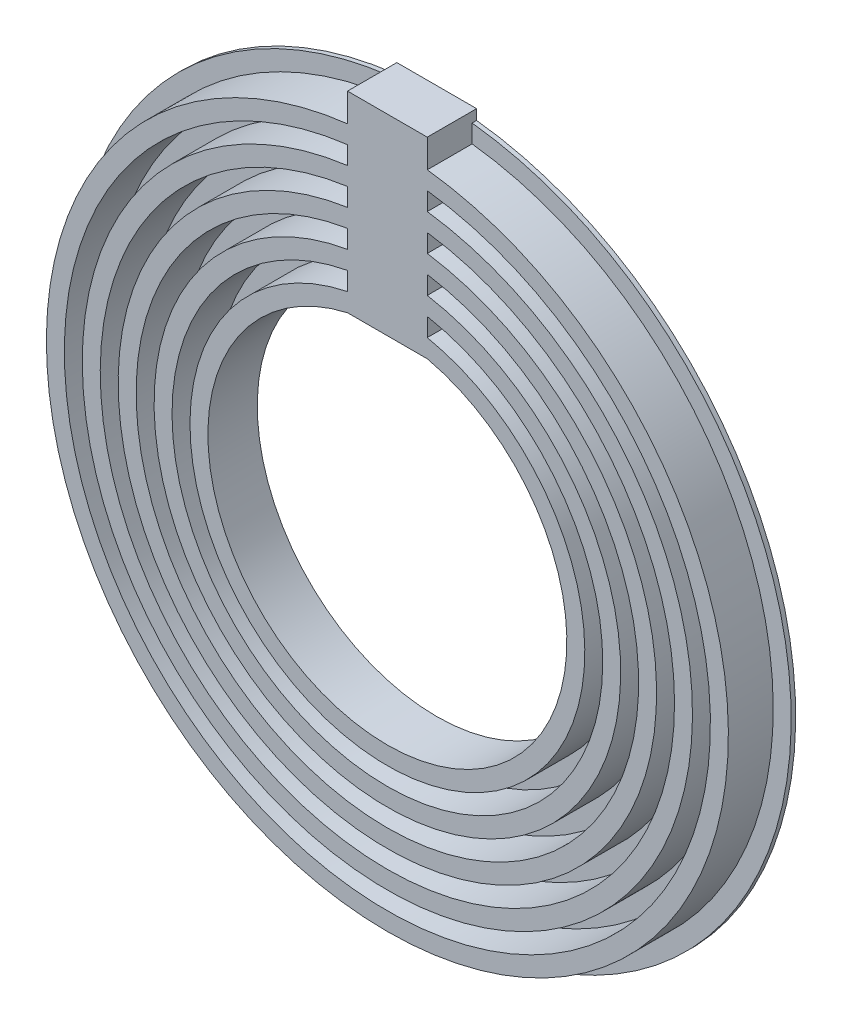
ISO-10303-21;
HEADER;
FILE_DESCRIPTION(('STEP AP214'),'2;1');
FILE_NAME('part.step','',(''),(''),'','','');
FILE_SCHEMA(('AUTOMOTIVE_DESIGN { 1 0 10303 214 1 1 1 1 }'));
ENDSEC;
DATA;
#1=APPLICATION_CONTEXT('core data for automotive mechanical design processes');
#2=APPLICATION_PROTOCOL_DEFINITION('international standard','automotive_design',2000,#1);
#3=PRODUCT_CONTEXT('',#1,'mechanical');
#4=PRODUCT('Part','Part','',(#3));
#5=PRODUCT_RELATED_PRODUCT_CATEGORY('part','',(#4));
#6=PRODUCT_DEFINITION_FORMATION('','',#4);
#7=PRODUCT_DEFINITION_CONTEXT('part definition',#1,'design');
#8=PRODUCT_DEFINITION('design','',#6,#7);
#9=PRODUCT_DEFINITION_SHAPE('','',#8);
#10=(LENGTH_UNIT() NAMED_UNIT(*) SI_UNIT(.MILLI.,.METRE.));
#11=(NAMED_UNIT(*) PLANE_ANGLE_UNIT() SI_UNIT($,.RADIAN.));
#12=(NAMED_UNIT(*) SI_UNIT($,.STERADIAN.) SOLID_ANGLE_UNIT());
#13=UNCERTAINTY_MEASURE_WITH_UNIT(LENGTH_MEASURE(1.E-05),#10,'distance_accuracy_value','');
#14=(GEOMETRIC_REPRESENTATION_CONTEXT(3) GLOBAL_UNCERTAINTY_ASSIGNED_CONTEXT((#13)) GLOBAL_UNIT_ASSIGNED_CONTEXT((#10,
#11,#12)) REPRESENTATION_CONTEXT('',''));
#15=CARTESIAN_POINT('',(0.,0.,0.));
#16=DIRECTION('',(0.,0.,1.));
#17=DIRECTION('',(1.,0.,0.));
#18=AXIS2_PLACEMENT_3D('',#15,#16,#17);
#19=CARTESIAN_POINT('',(0.,0.,2.75));
#20=DIRECTION('',(0.,0.,-1.));
#21=DIRECTION('',(-1.,0.,0.));
#22=AXIS2_PLACEMENT_3D('',#19,#20,#21);
#23=CYLINDRICAL_SURFACE('',#22,10.);
#24=CARTESIAN_POINT('',(0.,0.,2.75));
#25=DIRECTION('',(0.,0.,1.));
#26=DIRECTION('',(1.,0.,0.));
#27=AXIS2_PLACEMENT_3D('',#24,#25,#26);
#28=CIRCLE('',#27,10.);
#29=CARTESIAN_POINT('',(-2.22204860432891,9.75,2.75));
#30=VERTEX_POINT('',#29);
#31=CARTESIAN_POINT('',(2.22204860432891,9.75,2.75));
#32=VERTEX_POINT('',#31);
#33=EDGE_CURVE('E432',#30,#32,#28,.T.);
#34=ORIENTED_EDGE('',*,*,#33,.T.);
#35=DIRECTION('',(0.,0.,1.));
#36=VECTOR('',#35,1.);
#37=CARTESIAN_POINT('',(2.22204860432891,9.75,0.));
#38=LINE('',#37,#36);
#39=CARTESIAN_POINT('',(2.22204860432889,9.75,0.));
#40=VERTEX_POINT('',#39);
#41=EDGE_CURVE('E302',#40,#32,#38,.T.);
#42=ORIENTED_EDGE('',*,*,#41,.F.);
#43=CARTESIAN_POINT('',(0.,0.,0.));
#44=DIRECTION('',(0.,0.,1.));
#45=DIRECTION('',(1.,0.,0.));
#46=AXIS2_PLACEMENT_3D('',#43,#44,#45);
#47=CIRCLE('',#46,10.);
#48=CARTESIAN_POINT('',(-2.22204860432891,9.75,0.));
#49=VERTEX_POINT('',#48);
#50=EDGE_CURVE('E428',#49,#40,#47,.T.);
#51=ORIENTED_EDGE('',*,*,#50,.F.);
#52=DIRECTION('',(0.,0.,1.));
#53=VECTOR('',#52,1.);
#54=CARTESIAN_POINT('',(-2.22204860432891,9.75,0.));
#55=LINE('',#54,#53);
#56=EDGE_CURVE('E266',#49,#30,#55,.T.);
#57=ORIENTED_EDGE('',*,*,#56,.T.);
#58=EDGE_LOOP('',(#34,#42,#51,#57));
#59=FACE_BOUND('',#58,.T.);
#60=ADVANCED_FACE('F95',(#59),#23,.F.);
#61=CARTESIAN_POINT('',(0.,0.,2.75));
#62=DIRECTION('',(0.,0.,-1.));
#63=DIRECTION('',(-1.,0.,0.));
#64=AXIS2_PLACEMENT_3D('',#61,#62,#63);
#65=CYLINDRICAL_SURFACE('',#64,20.);
#66=CARTESIAN_POINT('',(0.,0.,0.));
#67=DIRECTION('',(0.,0.,1.));
#68=DIRECTION('',(1.,0.,0.));
#69=AXIS2_PLACEMENT_3D('',#66,#67,#68);
#70=CIRCLE('',#69,20.);
#71=CARTESIAN_POINT('',(-2.22204860432891,19.876179210301,0.));
#72=VERTEX_POINT('',#71);
#73=CARTESIAN_POINT('',(2.22204860432891,19.876179210301,0.));
#74=VERTEX_POINT('',#73);
#75=EDGE_CURVE('E114',#72,#74,#70,.T.);
#76=ORIENTED_EDGE('',*,*,#75,.T.);
#77=DIRECTION('',(0.,0.,-1.));
#78=VECTOR('',#77,1.);
#79=CARTESIAN_POINT('',(2.22204860432891,19.876179210301,2.75));
#80=LINE('',#79,#78);
#81=CARTESIAN_POINT('',(2.22204860432891,19.876179210301,0.25));
#82=VERTEX_POINT('',#81);
#83=EDGE_CURVE('E344',#74,#82,#80,.F.);
#84=ORIENTED_EDGE('',*,*,#83,.T.);
#85=CARTESIAN_POINT('',(0.,0.,0.25));
#86=DIRECTION('',(0.,0.,1.));
#87=DIRECTION('',(1.,0.,0.));
#88=AXIS2_PLACEMENT_3D('',#85,#86,#87);
#89=CIRCLE('',#88,20.);
#90=CARTESIAN_POINT('',(-2.22204860432891,19.876179210301,0.25));
#91=VERTEX_POINT('',#90);
#92=EDGE_CURVE('E382',#91,#82,#89,.T.);
#93=ORIENTED_EDGE('',*,*,#92,.F.);
#94=DIRECTION('',(0.,0.,-1.));
#95=VECTOR('',#94,1.);
#96=CARTESIAN_POINT('',(-2.22204860432891,19.876179210301,2.75));
#97=LINE('',#96,#95);
#98=EDGE_CURVE('E110',#91,#72,#97,.T.);
#99=ORIENTED_EDGE('',*,*,#98,.T.);
#100=EDGE_LOOP('',(#76,#84,#93,#99));
#101=FACE_BOUND('',#100,.T.);
#102=ADVANCED_FACE('F97',(#101),#65,.T.);
#103=CARTESIAN_POINT('',(0.,0.,2.75));
#104=DIRECTION('',(0.,0.,1.));
#105=DIRECTION('',(1.,0.,0.));
#106=AXIS2_PLACEMENT_3D('',#103,#104,#105);
#107=PLANE('',#106);
#108=CARTESIAN_POINT('',(0.,0.,2.75));
#109=DIRECTION('',(0.,0.,1.));
#110=DIRECTION('',(1.,0.,0.));
#111=AXIS2_PLACEMENT_3D('',#108,#109,#110);
#112=CIRCLE('',#111,19.);
#113=CARTESIAN_POINT('',(-2.22204860432891,18.8696184381137,2.75));
#114=VERTEX_POINT('',#113);
#115=CARTESIAN_POINT('',(2.22204860432891,18.8696184381137,2.75));
#116=VERTEX_POINT('',#115);
#117=EDGE_CURVE('E378',#114,#116,#112,.T.);
#118=ORIENTED_EDGE('',*,*,#117,.T.);
#119=DIRECTION('',(0.,1.,0.));
#120=VECTOR('',#119,1.);
#121=CARTESIAN_POINT('',(2.22204860432891,0.,2.75));
#122=LINE('',#121,#120);
#123=CARTESIAN_POINT('',(2.22204860432891,20.446693488374,2.75));
#124=VERTEX_POINT('',#123);
#125=EDGE_CURVE('E286',#116,#124,#122,.T.);
#126=ORIENTED_EDGE('',*,*,#125,.T.);
#127=DIRECTION('',(-1.,0.,0.));
#128=VECTOR('',#127,1.);
#129=CARTESIAN_POINT('',(0.,20.446693488374,2.75));
#130=LINE('',#129,#128);
#131=CARTESIAN_POINT('',(-2.22204860432891,20.446693488374,2.75));
#132=VERTEX_POINT('',#131);
#133=EDGE_CURVE('E291',#124,#132,#130,.T.);
#134=ORIENTED_EDGE('',*,*,#133,.T.);
#135=DIRECTION('',(0.,-1.,0.));
#136=VECTOR('',#135,1.);
#137=CARTESIAN_POINT('',(-2.22204860432891,0.,2.75));
#138=LINE('',#137,#136);
#139=EDGE_CURVE('E261',#132,#114,#138,.T.);
#140=ORIENTED_EDGE('',*,*,#139,.T.);
#141=EDGE_LOOP('',(#118,#126,#134,#140));
#142=FACE_BOUND('',#141,.T.);
#143=CARTESIAN_POINT('',(0.,0.,2.75));
#144=DIRECTION('',(0.,0.,1.));
#145=DIRECTION('',(1.,0.,0.));
#146=AXIS2_PLACEMENT_3D('',#143,#144,#145);
#147=CIRCLE('',#146,17.);
#148=CARTESIAN_POINT('',(-2.22204860432891,16.8541537906832,2.75));
#149=VERTEX_POINT('',#148);
#150=CARTESIAN_POINT('',(2.22204860432891,16.8541537906832,2.75));
#151=VERTEX_POINT('',#150);
#152=EDGE_CURVE('E385',#149,#151,#147,.T.);
#153=ORIENTED_EDGE('',*,*,#152,.T.);
#154=CARTESIAN_POINT('',(2.22204860432891,17.8623206778962,2.75));
#155=VERTEX_POINT('',#154);
#156=EDGE_CURVE('E299',#151,#155,#122,.T.);
#157=ORIENTED_EDGE('',*,*,#156,.T.);
#158=CARTESIAN_POINT('',(0.,0.,2.75));
#159=DIRECTION('',(0.,0.,1.));
#160=DIRECTION('',(1.,0.,0.));
#161=AXIS2_PLACEMENT_3D('',#158,#159,#160);
#162=CIRCLE('',#161,18.);
#163=CARTESIAN_POINT('',(-2.22204860432891,17.8623206778962,2.75));
#164=VERTEX_POINT('',#163);
#165=EDGE_CURVE('E392',#164,#155,#162,.T.);
#166=ORIENTED_EDGE('',*,*,#165,.F.);
#167=EDGE_CURVE('E296',#164,#149,#138,.T.);
#168=ORIENTED_EDGE('',*,*,#167,.T.);
#169=EDGE_LOOP('',(#153,#157,#166,#168));
#170=FACE_BOUND('',#169,.T.);
#171=CARTESIAN_POINT('',(0.,0.,2.75));
#172=DIRECTION('',(0.,0.,1.));
#173=DIRECTION('',(1.,0.,0.));
#174=AXIS2_PLACEMENT_3D('',#171,#172,#173);
#175=CIRCLE('',#174,15.);
#176=CARTESIAN_POINT('',(-2.22204860432891,14.8345036991468,2.75));
#177=VERTEX_POINT('',#176);
#178=CARTESIAN_POINT('',(2.22204860432891,14.8345036991468,2.75));
#179=VERTEX_POINT('',#178);
#180=EDGE_CURVE('E395',#177,#179,#175,.T.);
#181=ORIENTED_EDGE('',*,*,#180,.T.);
#182=CARTESIAN_POINT('',(2.22204860432891,15.8449518774908,2.75));
#183=VERTEX_POINT('',#182);
#184=EDGE_CURVE('E571',#179,#183,#122,.T.);
#185=ORIENTED_EDGE('',*,*,#184,.T.);
#186=CARTESIAN_POINT('',(0.,0.,2.75));
#187=DIRECTION('',(0.,0.,1.));
#188=DIRECTION('',(1.,0.,0.));
#189=AXIS2_PLACEMENT_3D('',#186,#187,#188);
#190=CIRCLE('',#189,16.);
#191=CARTESIAN_POINT('',(-2.22204860432891,15.8449518774908,2.75));
#192=VERTEX_POINT('',#191);
#193=EDGE_CURVE('E403',#192,#183,#190,.T.);
#194=ORIENTED_EDGE('',*,*,#193,.F.);
#195=EDGE_CURVE('E579',#192,#177,#138,.T.);
#196=ORIENTED_EDGE('',*,*,#195,.T.);
#197=EDGE_LOOP('',(#181,#185,#194,#196));
#198=FACE_BOUND('',#197,.T.);
#199=CARTESIAN_POINT('',(0.,0.,2.75));
#200=DIRECTION('',(0.,0.,1.));
#201=DIRECTION('',(1.,0.,0.));
#202=AXIS2_PLACEMENT_3D('',#199,#200,#201);
#203=CIRCLE('',#202,13.);
#204=CARTESIAN_POINT('',(-2.22204860432891,12.8086884574495,2.75));
#205=VERTEX_POINT('',#204);
#206=CARTESIAN_POINT('',(2.22204860432891,12.8086884574495,2.75));
#207=VERTEX_POINT('',#206);
#208=EDGE_CURVE('E406',#205,#207,#203,.T.);
#209=ORIENTED_EDGE('',*,*,#208,.T.);
#210=CARTESIAN_POINT('',(2.22204860432891,13.8225359467791,2.75));
#211=VERTEX_POINT('',#210);
#212=EDGE_CURVE('E284',#207,#211,#122,.T.);
#213=ORIENTED_EDGE('',*,*,#212,.T.);
#214=CARTESIAN_POINT('',(0.,0.,2.75));
#215=DIRECTION('',(0.,0.,1.));
#216=DIRECTION('',(1.,0.,0.));
#217=AXIS2_PLACEMENT_3D('',#214,#215,#216);
#218=CIRCLE('',#217,14.);
#219=CARTESIAN_POINT('',(-2.22204860432891,13.8225359467791,2.75));
#220=VERTEX_POINT('',#219);
#221=EDGE_CURVE('E414',#220,#211,#218,.T.);
#222=ORIENTED_EDGE('',*,*,#221,.F.);
#223=EDGE_CURVE('E580',#220,#205,#138,.T.);
#224=ORIENTED_EDGE('',*,*,#223,.T.);
#225=EDGE_LOOP('',(#209,#213,#222,#224));
#226=FACE_BOUND('',#225,.T.);
#227=CARTESIAN_POINT('',(0.,0.,2.75));
#228=DIRECTION('',(0.,0.,1.));
#229=DIRECTION('',(1.,0.,0.));
#230=AXIS2_PLACEMENT_3D('',#227,#228,#229);
#231=CIRCLE('',#230,11.);
#232=CARTESIAN_POINT('',(-2.22204860432891,10.7732307132076,2.75));
#233=VERTEX_POINT('',#232);
#234=CARTESIAN_POINT('',(2.22204860432891,10.7732307132076,2.75));
#235=VERTEX_POINT('',#234);
#236=EDGE_CURVE('E417',#233,#235,#231,.T.);
#237=ORIENTED_EDGE('',*,*,#236,.T.);
#238=CARTESIAN_POINT('',(2.22204860432891,11.7924764150708,2.75));
#239=VERTEX_POINT('',#238);
#240=EDGE_CURVE('E281',#235,#239,#122,.T.);
#241=ORIENTED_EDGE('',*,*,#240,.T.);
#242=CARTESIAN_POINT('',(0.,0.,2.75));
#243=DIRECTION('',(0.,0.,1.));
#244=DIRECTION('',(1.,0.,0.));
#245=AXIS2_PLACEMENT_3D('',#242,#243,#244);
#246=CIRCLE('',#245,12.);
#247=CARTESIAN_POINT('',(-2.22204860432891,11.7924764150708,2.75));
#248=VERTEX_POINT('',#247);
#249=EDGE_CURVE('E425',#248,#239,#246,.T.);
#250=ORIENTED_EDGE('',*,*,#249,.F.);
#251=EDGE_CURVE('E293',#248,#233,#138,.T.);
#252=ORIENTED_EDGE('',*,*,#251,.T.);
#253=EDGE_LOOP('',(#237,#241,#250,#252));
#254=FACE_BOUND('',#253,.T.);
#255=DIRECTION('',(-1.,0.,0.));
#256=VECTOR('',#255,1.);
#257=CARTESIAN_POINT('',(0.,9.75,2.75));
#258=LINE('',#257,#256);
#259=EDGE_CURVE('E295',#32,#30,#258,.T.);
#260=ORIENTED_EDGE('',*,*,#259,.F.);
#261=ORIENTED_EDGE('',*,*,#33,.F.);
#262=EDGE_LOOP('',(#260,#261));
#263=FACE_BOUND('',#262,.T.);
#264=ADVANCED_FACE('F446',(#142,#170,#198,#226,#254,#263),#107,.T.);
#265=CARTESIAN_POINT('',(0.,0.,0.));
#266=DIRECTION('',(0.,0.,1.));
#267=DIRECTION('',(1.,0.,0.));
#268=AXIS2_PLACEMENT_3D('',#265,#266,#267);
#269=PLANE('',#268);
#270=ORIENTED_EDGE('',*,*,#75,.F.);
#271=DIRECTION('',(0.,-1.,0.));
#272=VECTOR('',#271,1.);
#273=CARTESIAN_POINT('',(-2.22204860432891,0.,0.));
#274=LINE('',#273,#272);
#275=CARTESIAN_POINT('',(-2.22204860432891,20.446693488374,0.));
#276=VERTEX_POINT('',#275);
#277=EDGE_CURVE('E258',#276,#72,#274,.T.);
#278=ORIENTED_EDGE('',*,*,#277,.F.);
#279=DIRECTION('',(-1.,0.,0.));
#280=VECTOR('',#279,1.);
#281=CARTESIAN_POINT('',(0.,20.446693488374,0.));
#282=LINE('',#281,#280);
#283=CARTESIAN_POINT('',(2.22204860432891,20.446693488374,0.));
#284=VERTEX_POINT('',#283);
#285=EDGE_CURVE('E274',#284,#276,#282,.T.);
#286=ORIENTED_EDGE('',*,*,#285,.F.);
#287=DIRECTION('',(0.,1.,0.));
#288=VECTOR('',#287,1.);
#289=CARTESIAN_POINT('',(2.22204860432891,0.,0.));
#290=LINE('',#289,#288);
#291=EDGE_CURVE('E267',#74,#284,#290,.T.);
#292=ORIENTED_EDGE('',*,*,#291,.F.);
#293=EDGE_LOOP('',(#270,#278,#286,#292));
#294=FACE_BOUND('',#293,.T.);
#295=ORIENTED_EDGE('',*,*,#50,.T.);
#296=DIRECTION('',(-1.,0.,0.));
#297=VECTOR('',#296,1.);
#298=CARTESIAN_POINT('',(0.,9.75,0.));
#299=LINE('',#298,#297);
#300=EDGE_CURVE('E275',#40,#49,#299,.T.);
#301=ORIENTED_EDGE('',*,*,#300,.T.);
#302=EDGE_LOOP('',(#295,#301));
#303=FACE_BOUND('',#302,.T.);
#304=ADVANCED_FACE('F271',(#294,#303),#269,.F.);
#305=CARTESIAN_POINT('',(0.,0.,0.25));
#306=DIRECTION('',(0.,0.,1.));
#307=DIRECTION('',(1.,0.,0.));
#308=AXIS2_PLACEMENT_3D('',#305,#306,#307);
#309=CYLINDRICAL_SURFACE('',#308,11.);
#310=DIRECTION('',(0.,0.,1.));
#311=VECTOR('',#310,1.);
#312=CARTESIAN_POINT('',(2.22204860432891,10.7732307132076,0.25));
#313=LINE('',#312,#311);
#314=CARTESIAN_POINT('',(2.22204860432891,10.7732307132076,0.25));
#315=VERTEX_POINT('',#314);
#316=EDGE_CURVE('E375',#235,#315,#313,.F.);
#317=ORIENTED_EDGE('',*,*,#316,.F.);
#318=ORIENTED_EDGE('',*,*,#236,.F.);
#319=DIRECTION('',(0.,0.,1.));
#320=VECTOR('',#319,1.);
#321=CARTESIAN_POINT('',(-2.22204860432891,10.7732307132076,0.25));
#322=LINE('',#321,#320);
#323=CARTESIAN_POINT('',(-2.22204860432891,10.7732307132076,0.25));
#324=VERTEX_POINT('',#323);
#325=EDGE_CURVE('E338',#324,#233,#322,.T.);
#326=ORIENTED_EDGE('',*,*,#325,.F.);
#327=CARTESIAN_POINT('',(0.,0.,0.25));
#328=DIRECTION('',(0.,0.,1.));
#329=DIRECTION('',(1.,0.,0.));
#330=AXIS2_PLACEMENT_3D('',#327,#328,#329);
#331=CIRCLE('',#330,11.);
#332=EDGE_CURVE('E421',#324,#315,#331,.T.);
#333=ORIENTED_EDGE('',*,*,#332,.T.);
#334=EDGE_LOOP('',(#317,#318,#326,#333));
#335=FACE_BOUND('',#334,.T.);
#336=ADVANCED_FACE('F472',(#335),#309,.T.);
#337=CARTESIAN_POINT('',(0.,0.,0.25));
#338=DIRECTION('',(0.,0.,1.));
#339=DIRECTION('',(1.,0.,0.));
#340=AXIS2_PLACEMENT_3D('',#337,#338,#339);
#341=CYLINDRICAL_SURFACE('',#340,12.);
#342=ORIENTED_EDGE('',*,*,#249,.T.);
#343=DIRECTION('',(0.,0.,1.));
#344=VECTOR('',#343,1.);
#345=CARTESIAN_POINT('',(2.22204860432891,11.7924764150708,0.25));
#346=LINE('',#345,#344);
#347=CARTESIAN_POINT('',(2.22204860432891,11.7924764150708,0.25));
#348=VERTEX_POINT('',#347);
#349=EDGE_CURVE('E373',#239,#348,#346,.F.);
#350=ORIENTED_EDGE('',*,*,#349,.T.);
#351=CARTESIAN_POINT('',(0.,0.,0.25));
#352=DIRECTION('',(0.,0.,1.));
#353=DIRECTION('',(1.,0.,0.));
#354=AXIS2_PLACEMENT_3D('',#351,#352,#353);
#355=CIRCLE('',#354,12.);
#356=CARTESIAN_POINT('',(-2.22204860432891,11.7924764150708,0.25));
#357=VERTEX_POINT('',#356);
#358=EDGE_CURVE('E424',#357,#348,#355,.T.);
#359=ORIENTED_EDGE('',*,*,#358,.F.);
#360=DIRECTION('',(0.,0.,1.));
#361=VECTOR('',#360,1.);
#362=CARTESIAN_POINT('',(-2.22204860432891,11.7924764150708,0.25));
#363=LINE('',#362,#361);
#364=EDGE_CURVE('E336',#357,#248,#363,.T.);
#365=ORIENTED_EDGE('',*,*,#364,.T.);
#366=EDGE_LOOP('',(#342,#350,#359,#365));
#367=FACE_BOUND('',#366,.T.);
#368=ADVANCED_FACE('F476',(#367),#341,.F.);
#369=CARTESIAN_POINT('',(0.,0.,0.25));
#370=DIRECTION('',(0.,0.,1.));
#371=DIRECTION('',(1.,0.,0.));
#372=AXIS2_PLACEMENT_3D('',#369,#370,#371);
#373=PLANE('',#372);
#374=DIRECTION('',(0.,1.,0.));
#375=VECTOR('',#374,1.);
#376=CARTESIAN_POINT('',(2.22204860432891,0.,0.25));
#377=LINE('',#376,#375);
#378=EDGE_CURVE('E370',#315,#348,#377,.T.);
#379=ORIENTED_EDGE('',*,*,#378,.F.);
#380=ORIENTED_EDGE('',*,*,#332,.F.);
#381=DIRECTION('',(0.,-1.,0.));
#382=VECTOR('',#381,1.);
#383=CARTESIAN_POINT('',(-2.22204860432891,0.,0.25));
#384=LINE('',#383,#382);
#385=EDGE_CURVE('E333',#357,#324,#384,.T.);
#386=ORIENTED_EDGE('',*,*,#385,.F.);
#387=ORIENTED_EDGE('',*,*,#358,.T.);
#388=EDGE_LOOP('',(#379,#380,#386,#387));
#389=FACE_BOUND('',#388,.T.);
#390=ADVANCED_FACE('F487',(#389),#373,.T.);
#391=CARTESIAN_POINT('',(0.,0.,0.25));
#392=DIRECTION('',(0.,0.,1.));
#393=DIRECTION('',(1.,0.,0.));
#394=AXIS2_PLACEMENT_3D('',#391,#392,#393);
#395=CYLINDRICAL_SURFACE('',#394,13.);
#396=DIRECTION('',(0.,0.,1.));
#397=VECTOR('',#396,1.);
#398=CARTESIAN_POINT('',(2.22204860432891,12.8086884574495,0.25));
#399=LINE('',#398,#397);
#400=CARTESIAN_POINT('',(2.22204860432891,12.8086884574495,0.25));
#401=VERTEX_POINT('',#400);
#402=EDGE_CURVE('E367',#207,#401,#399,.F.);
#403=ORIENTED_EDGE('',*,*,#402,.F.);
#404=ORIENTED_EDGE('',*,*,#208,.F.);
#405=DIRECTION('',(0.,0.,1.));
#406=VECTOR('',#405,1.);
#407=CARTESIAN_POINT('',(-2.22204860432891,12.8086884574495,0.25));
#408=LINE('',#407,#406);
#409=CARTESIAN_POINT('',(-2.22204860432891,12.8086884574495,0.25));
#410=VERTEX_POINT('',#409);
#411=EDGE_CURVE('E330',#410,#205,#408,.T.);
#412=ORIENTED_EDGE('',*,*,#411,.F.);
#413=CARTESIAN_POINT('',(0.,0.,0.25));
#414=DIRECTION('',(0.,0.,1.));
#415=DIRECTION('',(1.,0.,0.));
#416=AXIS2_PLACEMENT_3D('',#413,#414,#415);
#417=CIRCLE('',#416,13.);
#418=EDGE_CURVE('E410',#410,#401,#417,.T.);
#419=ORIENTED_EDGE('',*,*,#418,.T.);
#420=EDGE_LOOP('',(#403,#404,#412,#419));
#421=FACE_BOUND('',#420,.T.);
#422=ADVANCED_FACE('F491',(#421),#395,.T.);
#423=CARTESIAN_POINT('',(0.,0.,0.25));
#424=DIRECTION('',(0.,0.,1.));
#425=DIRECTION('',(1.,0.,0.));
#426=AXIS2_PLACEMENT_3D('',#423,#424,#425);
#427=CYLINDRICAL_SURFACE('',#426,14.);
#428=ORIENTED_EDGE('',*,*,#221,.T.);
#429=DIRECTION('',(0.,0.,1.));
#430=VECTOR('',#429,1.);
#431=CARTESIAN_POINT('',(2.22204860432891,13.8225359467791,0.25));
#432=LINE('',#431,#430);
#433=CARTESIAN_POINT('',(2.22204860432891,13.8225359467791,0.25));
#434=VERTEX_POINT('',#433);
#435=EDGE_CURVE('E365',#211,#434,#432,.F.);
#436=ORIENTED_EDGE('',*,*,#435,.T.);
#437=CARTESIAN_POINT('',(0.,0.,0.25));
#438=DIRECTION('',(0.,0.,1.));
#439=DIRECTION('',(1.,0.,0.));
#440=AXIS2_PLACEMENT_3D('',#437,#438,#439);
#441=CIRCLE('',#440,14.);
#442=CARTESIAN_POINT('',(-2.22204860432891,13.8225359467791,0.25));
#443=VERTEX_POINT('',#442);
#444=EDGE_CURVE('E413',#443,#434,#441,.T.);
#445=ORIENTED_EDGE('',*,*,#444,.F.);
#446=DIRECTION('',(0.,0.,1.));
#447=VECTOR('',#446,1.);
#448=CARTESIAN_POINT('',(-2.22204860432891,13.8225359467791,0.25));
#449=LINE('',#448,#447);
#450=EDGE_CURVE('E328',#443,#220,#449,.T.);
#451=ORIENTED_EDGE('',*,*,#450,.T.);
#452=EDGE_LOOP('',(#428,#436,#445,#451));
#453=FACE_BOUND('',#452,.T.);
#454=ADVANCED_FACE('F495',(#453),#427,.F.);
#455=CARTESIAN_POINT('',(0.,0.,0.25));
#456=DIRECTION('',(0.,0.,1.));
#457=DIRECTION('',(1.,0.,0.));
#458=AXIS2_PLACEMENT_3D('',#455,#456,#457);
#459=PLANE('',#458);
#460=DIRECTION('',(0.,1.,0.));
#461=VECTOR('',#460,1.);
#462=CARTESIAN_POINT('',(2.22204860432891,0.,0.25));
#463=LINE('',#462,#461);
#464=EDGE_CURVE('E362',#401,#434,#463,.T.);
#465=ORIENTED_EDGE('',*,*,#464,.F.);
#466=ORIENTED_EDGE('',*,*,#418,.F.);
#467=DIRECTION('',(0.,-1.,0.));
#468=VECTOR('',#467,1.);
#469=CARTESIAN_POINT('',(-2.22204860432891,0.,0.25));
#470=LINE('',#469,#468);
#471=EDGE_CURVE('E325',#443,#410,#470,.T.);
#472=ORIENTED_EDGE('',*,*,#471,.F.);
#473=ORIENTED_EDGE('',*,*,#444,.T.);
#474=EDGE_LOOP('',(#465,#466,#472,#473));
#475=FACE_BOUND('',#474,.T.);
#476=ADVANCED_FACE('F499',(#475),#459,.T.);
#477=CARTESIAN_POINT('',(0.,0.,0.25));
#478=DIRECTION('',(0.,0.,1.));
#479=DIRECTION('',(1.,0.,0.));
#480=AXIS2_PLACEMENT_3D('',#477,#478,#479);
#481=CYLINDRICAL_SURFACE('',#480,15.);
#482=DIRECTION('',(0.,0.,1.));
#483=VECTOR('',#482,1.);
#484=CARTESIAN_POINT('',(2.22204860432891,14.8345036991468,0.25));
#485=LINE('',#484,#483);
#486=CARTESIAN_POINT('',(2.22204860432891,14.8345036991468,0.25));
#487=VERTEX_POINT('',#486);
#488=EDGE_CURVE('E359',#179,#487,#485,.F.);
#489=ORIENTED_EDGE('',*,*,#488,.F.);
#490=ORIENTED_EDGE('',*,*,#180,.F.);
#491=DIRECTION('',(0.,0.,1.));
#492=VECTOR('',#491,1.);
#493=CARTESIAN_POINT('',(-2.22204860432891,14.8345036991468,0.25));
#494=LINE('',#493,#492);
#495=CARTESIAN_POINT('',(-2.22204860432891,14.8345036991468,0.25));
#496=VERTEX_POINT('',#495);
#497=EDGE_CURVE('E322',#496,#177,#494,.T.);
#498=ORIENTED_EDGE('',*,*,#497,.F.);
#499=CARTESIAN_POINT('',(0.,0.,0.25));
#500=DIRECTION('',(0.,0.,1.));
#501=DIRECTION('',(1.,0.,0.));
#502=AXIS2_PLACEMENT_3D('',#499,#500,#501);
#503=CIRCLE('',#502,15.);
#504=EDGE_CURVE('E399',#496,#487,#503,.T.);
#505=ORIENTED_EDGE('',*,*,#504,.T.);
#506=EDGE_LOOP('',(#489,#490,#498,#505));
#507=FACE_BOUND('',#506,.T.);
#508=ADVANCED_FACE('F503',(#507),#481,.T.);
#509=CARTESIAN_POINT('',(0.,0.,0.25));
#510=DIRECTION('',(0.,0.,1.));
#511=DIRECTION('',(1.,0.,0.));
#512=AXIS2_PLACEMENT_3D('',#509,#510,#511);
#513=CYLINDRICAL_SURFACE('',#512,16.);
#514=ORIENTED_EDGE('',*,*,#193,.T.);
#515=DIRECTION('',(0.,0.,1.));
#516=VECTOR('',#515,1.);
#517=CARTESIAN_POINT('',(2.22204860432891,15.8449518774908,0.25));
#518=LINE('',#517,#516);
#519=CARTESIAN_POINT('',(2.22204860432891,15.8449518774908,0.25));
#520=VERTEX_POINT('',#519);
#521=EDGE_CURVE('E357',#183,#520,#518,.F.);
#522=ORIENTED_EDGE('',*,*,#521,.T.);
#523=CARTESIAN_POINT('',(0.,0.,0.25));
#524=DIRECTION('',(0.,0.,1.));
#525=DIRECTION('',(1.,0.,0.));
#526=AXIS2_PLACEMENT_3D('',#523,#524,#525);
#527=CIRCLE('',#526,16.);
#528=CARTESIAN_POINT('',(-2.22204860432891,15.8449518774908,0.25));
#529=VERTEX_POINT('',#528);
#530=EDGE_CURVE('E402',#529,#520,#527,.T.);
#531=ORIENTED_EDGE('',*,*,#530,.F.);
#532=DIRECTION('',(0.,0.,1.));
#533=VECTOR('',#532,1.);
#534=CARTESIAN_POINT('',(-2.22204860432891,15.8449518774908,0.25));
#535=LINE('',#534,#533);
#536=EDGE_CURVE('E320',#529,#192,#535,.T.);
#537=ORIENTED_EDGE('',*,*,#536,.T.);
#538=EDGE_LOOP('',(#514,#522,#531,#537));
#539=FACE_BOUND('',#538,.T.);
#540=ADVANCED_FACE('F507',(#539),#513,.F.);
#541=CARTESIAN_POINT('',(0.,0.,0.25));
#542=DIRECTION('',(0.,0.,1.));
#543=DIRECTION('',(1.,0.,0.));
#544=AXIS2_PLACEMENT_3D('',#541,#542,#543);
#545=PLANE('',#544);
#546=DIRECTION('',(0.,1.,0.));
#547=VECTOR('',#546,1.);
#548=CARTESIAN_POINT('',(2.22204860432891,0.,0.25));
#549=LINE('',#548,#547);
#550=EDGE_CURVE('E354',#487,#520,#549,.T.);
#551=ORIENTED_EDGE('',*,*,#550,.F.);
#552=ORIENTED_EDGE('',*,*,#504,.F.);
#553=DIRECTION('',(0.,-1.,0.));
#554=VECTOR('',#553,1.);
#555=CARTESIAN_POINT('',(-2.22204860432891,0.,0.25));
#556=LINE('',#555,#554);
#557=EDGE_CURVE('E317',#529,#496,#556,.T.);
#558=ORIENTED_EDGE('',*,*,#557,.F.);
#559=ORIENTED_EDGE('',*,*,#530,.T.);
#560=EDGE_LOOP('',(#551,#552,#558,#559));
#561=FACE_BOUND('',#560,.T.);
#562=ADVANCED_FACE('F511',(#561),#545,.T.);
#563=CARTESIAN_POINT('',(0.,0.,0.25));
#564=DIRECTION('',(0.,0.,1.));
#565=DIRECTION('',(1.,0.,0.));
#566=AXIS2_PLACEMENT_3D('',#563,#564,#565);
#567=CYLINDRICAL_SURFACE('',#566,17.);
#568=DIRECTION('',(0.,0.,1.));
#569=VECTOR('',#568,1.);
#570=CARTESIAN_POINT('',(2.22204860432891,16.8541537906832,0.25));
#571=LINE('',#570,#569);
#572=CARTESIAN_POINT('',(2.22204860432891,16.8541537906832,0.25));
#573=VERTEX_POINT('',#572);
#574=EDGE_CURVE('E351',#151,#573,#571,.F.);
#575=ORIENTED_EDGE('',*,*,#574,.F.);
#576=ORIENTED_EDGE('',*,*,#152,.F.);
#577=DIRECTION('',(0.,0.,1.));
#578=VECTOR('',#577,1.);
#579=CARTESIAN_POINT('',(-2.22204860432891,16.8541537906832,0.25));
#580=LINE('',#579,#578);
#581=CARTESIAN_POINT('',(-2.22204860432891,16.8541537906832,0.25));
#582=VERTEX_POINT('',#581);
#583=EDGE_CURVE('E314',#582,#149,#580,.T.);
#584=ORIENTED_EDGE('',*,*,#583,.F.);
#585=CARTESIAN_POINT('',(0.,0.,0.25));
#586=DIRECTION('',(0.,0.,1.));
#587=DIRECTION('',(1.,0.,0.));
#588=AXIS2_PLACEMENT_3D('',#585,#586,#587);
#589=CIRCLE('',#588,17.);
#590=EDGE_CURVE('E388',#582,#573,#589,.T.);
#591=ORIENTED_EDGE('',*,*,#590,.T.);
#592=EDGE_LOOP('',(#575,#576,#584,#591));
#593=FACE_BOUND('',#592,.T.);
#594=ADVANCED_FACE('F515',(#593),#567,.T.);
#595=CARTESIAN_POINT('',(0.,0.,0.25));
#596=DIRECTION('',(0.,0.,1.));
#597=DIRECTION('',(1.,0.,0.));
#598=AXIS2_PLACEMENT_3D('',#595,#596,#597);
#599=CYLINDRICAL_SURFACE('',#598,18.);
#600=ORIENTED_EDGE('',*,*,#165,.T.);
#601=DIRECTION('',(0.,0.,1.));
#602=VECTOR('',#601,1.);
#603=CARTESIAN_POINT('',(2.22204860432891,17.8623206778962,0.25));
#604=LINE('',#603,#602);
#605=CARTESIAN_POINT('',(2.22204860432891,17.8623206778962,0.25));
#606=VERTEX_POINT('',#605);
#607=EDGE_CURVE('E349',#155,#606,#604,.F.);
#608=ORIENTED_EDGE('',*,*,#607,.T.);
#609=CARTESIAN_POINT('',(0.,0.,0.25));
#610=DIRECTION('',(0.,0.,1.));
#611=DIRECTION('',(1.,0.,0.));
#612=AXIS2_PLACEMENT_3D('',#609,#610,#611);
#613=CIRCLE('',#612,18.);
#614=CARTESIAN_POINT('',(-2.22204860432891,17.8623206778962,0.25));
#615=VERTEX_POINT('',#614);
#616=EDGE_CURVE('E391',#615,#606,#613,.T.);
#617=ORIENTED_EDGE('',*,*,#616,.F.);
#618=DIRECTION('',(0.,0.,1.));
#619=VECTOR('',#618,1.);
#620=CARTESIAN_POINT('',(-2.22204860432891,17.8623206778962,0.25));
#621=LINE('',#620,#619);
#622=EDGE_CURVE('E312',#615,#164,#621,.T.);
#623=ORIENTED_EDGE('',*,*,#622,.T.);
#624=EDGE_LOOP('',(#600,#608,#617,#623));
#625=FACE_BOUND('',#624,.T.);
#626=ADVANCED_FACE('F519',(#625),#599,.F.);
#627=CARTESIAN_POINT('',(0.,0.,0.25));
#628=DIRECTION('',(0.,0.,1.));
#629=DIRECTION('',(1.,0.,0.));
#630=AXIS2_PLACEMENT_3D('',#627,#628,#629);
#631=PLANE('',#630);
#632=DIRECTION('',(0.,1.,0.));
#633=VECTOR('',#632,1.);
#634=CARTESIAN_POINT('',(2.22204860432891,0.,0.25));
#635=LINE('',#634,#633);
#636=EDGE_CURVE('E346',#573,#606,#635,.T.);
#637=ORIENTED_EDGE('',*,*,#636,.F.);
#638=ORIENTED_EDGE('',*,*,#590,.F.);
#639=DIRECTION('',(0.,-1.,0.));
#640=VECTOR('',#639,1.);
#641=CARTESIAN_POINT('',(-2.22204860432891,0.,0.25));
#642=LINE('',#641,#640);
#643=EDGE_CURVE('E309',#615,#582,#642,.T.);
#644=ORIENTED_EDGE('',*,*,#643,.F.);
#645=ORIENTED_EDGE('',*,*,#616,.T.);
#646=EDGE_LOOP('',(#637,#638,#644,#645));
#647=FACE_BOUND('',#646,.T.);
#648=ADVANCED_FACE('F523',(#647),#631,.T.);
#649=CARTESIAN_POINT('',(0.,0.,0.25));
#650=DIRECTION('',(0.,0.,1.));
#651=DIRECTION('',(1.,0.,0.));
#652=AXIS2_PLACEMENT_3D('',#649,#650,#651);
#653=CYLINDRICAL_SURFACE('',#652,19.);
#654=DIRECTION('',(0.,0.,1.));
#655=VECTOR('',#654,1.);
#656=CARTESIAN_POINT('',(2.22204860432891,18.8696184381137,0.25));
#657=LINE('',#656,#655);
#658=CARTESIAN_POINT('',(2.22204860432891,18.8696184381137,0.25));
#659=VERTEX_POINT('',#658);
#660=EDGE_CURVE('E341',#116,#659,#657,.F.);
#661=ORIENTED_EDGE('',*,*,#660,.F.);
#662=ORIENTED_EDGE('',*,*,#117,.F.);
#663=DIRECTION('',(0.,0.,1.));
#664=VECTOR('',#663,1.);
#665=CARTESIAN_POINT('',(-2.22204860432891,18.8696184381137,0.25));
#666=LINE('',#665,#664);
#667=CARTESIAN_POINT('',(-2.22204860432891,18.8696184381137,0.25));
#668=VERTEX_POINT('',#667);
#669=EDGE_CURVE('E301',#668,#114,#666,.T.);
#670=ORIENTED_EDGE('',*,*,#669,.F.);
#671=CARTESIAN_POINT('',(0.,0.,0.25));
#672=DIRECTION('',(0.,0.,1.));
#673=DIRECTION('',(1.,0.,0.));
#674=AXIS2_PLACEMENT_3D('',#671,#672,#673);
#675=CIRCLE('',#674,19.);
#676=EDGE_CURVE('E379',#668,#659,#675,.T.);
#677=ORIENTED_EDGE('',*,*,#676,.T.);
#678=EDGE_LOOP('',(#661,#662,#670,#677));
#679=FACE_BOUND('',#678,.T.);
#680=ADVANCED_FACE('F444',(#679),#653,.T.);
#681=CARTESIAN_POINT('',(0.,0.,0.25));
#682=DIRECTION('',(0.,0.,1.));
#683=DIRECTION('',(1.,0.,0.));
#684=AXIS2_PLACEMENT_3D('',#681,#682,#683);
#685=PLANE('',#684);
#686=DIRECTION('',(0.,1.,0.));
#687=VECTOR('',#686,1.);
#688=CARTESIAN_POINT('',(2.22204860432891,0.,0.25));
#689=LINE('',#688,#687);
#690=EDGE_CURVE('E12',#659,#82,#689,.T.);
#691=ORIENTED_EDGE('',*,*,#690,.F.);
#692=ORIENTED_EDGE('',*,*,#676,.F.);
#693=DIRECTION('',(0.,-1.,0.));
#694=VECTOR('',#693,1.);
#695=CARTESIAN_POINT('',(-2.22204860432891,0.,0.25));
#696=LINE('',#695,#694);
#697=EDGE_CURVE('E103',#91,#668,#696,.T.);
#698=ORIENTED_EDGE('',*,*,#697,.F.);
#699=ORIENTED_EDGE('',*,*,#92,.T.);
#700=EDGE_LOOP('',(#691,#692,#698,#699));
#701=FACE_BOUND('',#700,.T.);
#702=ADVANCED_FACE('F439',(#701),#685,.T.);
#703=CARTESIAN_POINT('',(0.,20.446693488374,0.));
#704=DIRECTION('',(0.,1.,0.));
#705=DIRECTION('',(0.,0.,1.));
#706=AXIS2_PLACEMENT_3D('',#703,#704,#705);
#707=PLANE('',#706);
#708=ORIENTED_EDGE('',*,*,#133,.F.);
#709=DIRECTION('',(0.,0.,1.));
#710=VECTOR('',#709,1.);
#711=CARTESIAN_POINT('',(2.22204860432891,20.446693488374,0.));
#712=LINE('',#711,#710);
#713=EDGE_CURVE('E280',#284,#124,#712,.T.);
#714=ORIENTED_EDGE('',*,*,#713,.F.);
#715=ORIENTED_EDGE('',*,*,#285,.T.);
#716=DIRECTION('',(0.,0.,1.));
#717=VECTOR('',#716,1.);
#718=CARTESIAN_POINT('',(-2.22204860432891,20.446693488374,0.));
#719=LINE('',#718,#717);
#720=EDGE_CURVE('E255',#276,#132,#719,.T.);
#721=ORIENTED_EDGE('',*,*,#720,.T.);
#722=EDGE_LOOP('',(#708,#714,#715,#721));
#723=FACE_BOUND('',#722,.T.);
#724=ADVANCED_FACE('F278',(#723),#707,.T.);
#725=CARTESIAN_POINT('',(-2.22204860432891,0.,0.));
#726=DIRECTION('',(-1.,0.,0.));
#727=DIRECTION('',(0.,0.,1.));
#728=AXIS2_PLACEMENT_3D('',#725,#726,#727);
#729=PLANE('',#728);
#730=ORIENTED_EDGE('',*,*,#98,.F.);
#731=ORIENTED_EDGE('',*,*,#697,.T.);
#732=ORIENTED_EDGE('',*,*,#669,.T.);
#733=ORIENTED_EDGE('',*,*,#139,.F.);
#734=ORIENTED_EDGE('',*,*,#720,.F.);
#735=ORIENTED_EDGE('',*,*,#277,.T.);
#736=EDGE_LOOP('',(#730,#731,#732,#733,#734,#735));
#737=FACE_BOUND('',#736,.T.);
#738=ADVANCED_FACE('F257',(#737),#729,.T.);
#739=CARTESIAN_POINT('',(2.22204860432891,0.,0.));
#740=DIRECTION('',(1.,0.,0.));
#741=DIRECTION('',(0.,0.,-1.));
#742=AXIS2_PLACEMENT_3D('',#739,#740,#741);
#743=PLANE('',#742);
#744=ORIENTED_EDGE('',*,*,#83,.F.);
#745=ORIENTED_EDGE('',*,*,#291,.T.);
#746=ORIENTED_EDGE('',*,*,#713,.T.);
#747=ORIENTED_EDGE('',*,*,#125,.F.);
#748=ORIENTED_EDGE('',*,*,#660,.T.);
#749=ORIENTED_EDGE('',*,*,#690,.T.);
#750=EDGE_LOOP('',(#744,#745,#746,#747,#748,#749));
#751=FACE_BOUND('',#750,.T.);
#752=ADVANCED_FACE('F441',(#751),#743,.T.);
#753=ORIENTED_EDGE('',*,*,#156,.F.);
#754=ORIENTED_EDGE('',*,*,#574,.T.);
#755=ORIENTED_EDGE('',*,*,#636,.T.);
#756=ORIENTED_EDGE('',*,*,#607,.F.);
#757=EDGE_LOOP('',(#753,#754,#755,#756));
#758=FACE_BOUND('',#757,.T.);
#759=ADVANCED_FACE('F538',(#758),#743,.T.);
#760=ORIENTED_EDGE('',*,*,#643,.T.);
#761=ORIENTED_EDGE('',*,*,#583,.T.);
#762=ORIENTED_EDGE('',*,*,#167,.F.);
#763=ORIENTED_EDGE('',*,*,#622,.F.);
#764=EDGE_LOOP('',(#760,#761,#762,#763));
#765=FACE_BOUND('',#764,.T.);
#766=ADVANCED_FACE('F534',(#765),#729,.T.);
#767=ORIENTED_EDGE('',*,*,#184,.F.);
#768=ORIENTED_EDGE('',*,*,#488,.T.);
#769=ORIENTED_EDGE('',*,*,#550,.T.);
#770=ORIENTED_EDGE('',*,*,#521,.F.);
#771=EDGE_LOOP('',(#767,#768,#769,#770));
#772=FACE_BOUND('',#771,.T.);
#773=ADVANCED_FACE('F537',(#772),#743,.T.);
#774=ORIENTED_EDGE('',*,*,#557,.T.);
#775=ORIENTED_EDGE('',*,*,#497,.T.);
#776=ORIENTED_EDGE('',*,*,#195,.F.);
#777=ORIENTED_EDGE('',*,*,#536,.F.);
#778=EDGE_LOOP('',(#774,#775,#776,#777));
#779=FACE_BOUND('',#778,.T.);
#780=ADVANCED_FACE('F559',(#779),#729,.T.);
#781=ORIENTED_EDGE('',*,*,#212,.F.);
#782=ORIENTED_EDGE('',*,*,#402,.T.);
#783=ORIENTED_EDGE('',*,*,#464,.T.);
#784=ORIENTED_EDGE('',*,*,#435,.F.);
#785=EDGE_LOOP('',(#781,#782,#783,#784));
#786=FACE_BOUND('',#785,.T.);
#787=ADVANCED_FACE('F552',(#786),#743,.T.);
#788=ORIENTED_EDGE('',*,*,#471,.T.);
#789=ORIENTED_EDGE('',*,*,#411,.T.);
#790=ORIENTED_EDGE('',*,*,#223,.F.);
#791=ORIENTED_EDGE('',*,*,#450,.F.);
#792=EDGE_LOOP('',(#788,#789,#790,#791));
#793=FACE_BOUND('',#792,.T.);
#794=ADVANCED_FACE('F550',(#793),#729,.T.);
#795=ORIENTED_EDGE('',*,*,#240,.F.);
#796=ORIENTED_EDGE('',*,*,#316,.T.);
#797=ORIENTED_EDGE('',*,*,#378,.T.);
#798=ORIENTED_EDGE('',*,*,#349,.F.);
#799=EDGE_LOOP('',(#795,#796,#797,#798));
#800=FACE_BOUND('',#799,.T.);
#801=ADVANCED_FACE('F545',(#800),#743,.T.);
#802=ORIENTED_EDGE('',*,*,#385,.T.);
#803=ORIENTED_EDGE('',*,*,#325,.T.);
#804=ORIENTED_EDGE('',*,*,#251,.F.);
#805=ORIENTED_EDGE('',*,*,#364,.F.);
#806=EDGE_LOOP('',(#802,#803,#804,#805));
#807=FACE_BOUND('',#806,.T.);
#808=ADVANCED_FACE('F540',(#807),#729,.T.);
#809=CARTESIAN_POINT('',(0.,9.75,0.));
#810=DIRECTION('',(0.,1.,0.));
#811=DIRECTION('',(-1.,0.,0.));
#812=AXIS2_PLACEMENT_3D('',#809,#810,#811);
#813=PLANE('',#812);
#814=ORIENTED_EDGE('',*,*,#259,.T.);
#815=ORIENTED_EDGE('',*,*,#56,.F.);
#816=ORIENTED_EDGE('',*,*,#300,.F.);
#817=ORIENTED_EDGE('',*,*,#41,.T.);
#818=EDGE_LOOP('',(#814,#815,#816,#817));
#819=FACE_BOUND('',#818,.T.);
#820=ADVANCED_FACE('F468',(#819),#813,.F.);
#821=CLOSED_SHELL('',(#60,#102,#264,#304,#336,#368,#390,#422,#454,#476,#508,#540,#562,#594,#626,
#648,#680,#702,#724,#738,#752,#759,#766,#773,#780,#787,#794,#801,#808,#820));
#822=MANIFOLD_SOLID_BREP('B2',#821);
#823=ADVANCED_BREP_SHAPE_REPRESENTATION('',(#18,#822),#14);
#824=SHAPE_DEFINITION_REPRESENTATION(#9,#823);
ENDSEC;
END-ISO-10303-21;
